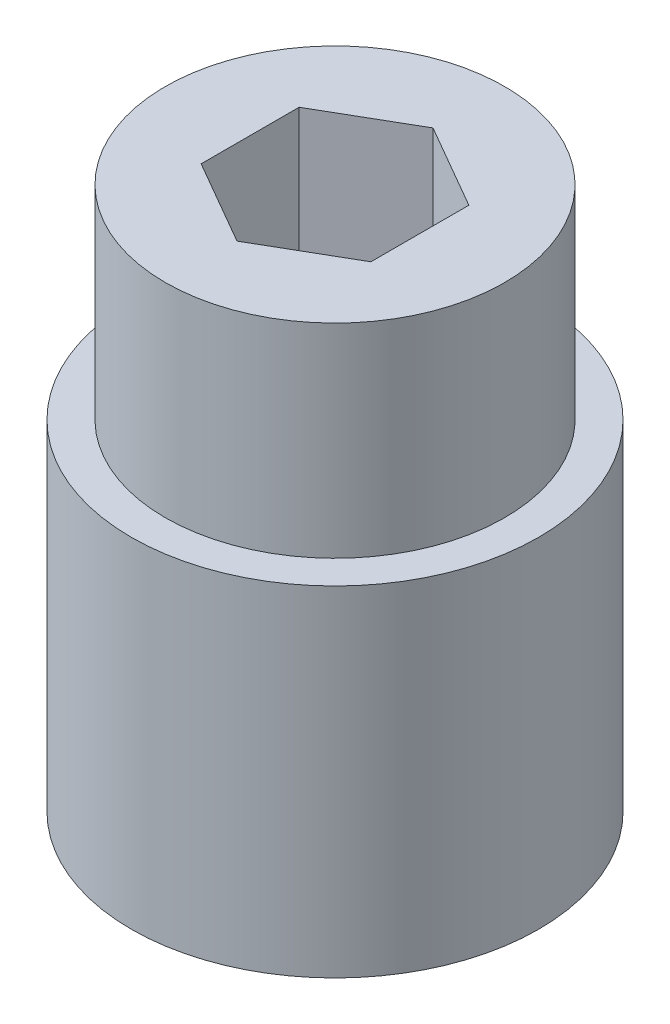
ISO-10303-21;
HEADER;
FILE_DESCRIPTION(('STEP AP214'),'2;1');
FILE_NAME('part.step','',(''),(''),'','','');
FILE_SCHEMA(('AUTOMOTIVE_DESIGN { 1 0 10303 214 1 1 1 1 }'));
ENDSEC;
DATA;
#1=APPLICATION_CONTEXT('core data for automotive mechanical design processes');
#2=APPLICATION_PROTOCOL_DEFINITION('international standard','automotive_design',2000,#1);
#3=PRODUCT_CONTEXT('',#1,'mechanical');
#4=PRODUCT('Part','Part','',(#3));
#5=PRODUCT_RELATED_PRODUCT_CATEGORY('part','',(#4));
#6=PRODUCT_DEFINITION_FORMATION('','',#4);
#7=PRODUCT_DEFINITION_CONTEXT('part definition',#1,'design');
#8=PRODUCT_DEFINITION('design','',#6,#7);
#9=PRODUCT_DEFINITION_SHAPE('','',#8);
#10=(LENGTH_UNIT() NAMED_UNIT(*) SI_UNIT(.MILLI.,.METRE.));
#11=(NAMED_UNIT(*) PLANE_ANGLE_UNIT() SI_UNIT($,.RADIAN.));
#12=(NAMED_UNIT(*) SI_UNIT($,.STERADIAN.) SOLID_ANGLE_UNIT());
#13=UNCERTAINTY_MEASURE_WITH_UNIT(LENGTH_MEASURE(1.E-05),#10,'distance_accuracy_value','');
#14=(GEOMETRIC_REPRESENTATION_CONTEXT(3) GLOBAL_UNCERTAINTY_ASSIGNED_CONTEXT((#13)) GLOBAL_UNIT_ASSIGNED_CONTEXT((#10,
#11,#12)) REPRESENTATION_CONTEXT('',''));
#15=CARTESIAN_POINT('',(0.,0.,0.));
#16=DIRECTION('',(0.,0.,1.));
#17=DIRECTION('',(1.,0.,0.));
#18=AXIS2_PLACEMENT_3D('',#15,#16,#17);
#19=CARTESIAN_POINT('',(0.,10.,0.));
#20=DIRECTION('',(0.,1.,0.));
#21=DIRECTION('',(0.,0.,1.));
#22=AXIS2_PLACEMENT_3D('',#19,#20,#21);
#23=PLANE('',#22);
#24=CARTESIAN_POINT('',(0.,10.,0.));
#25=DIRECTION('',(0.,1.,0.));
#26=DIRECTION('',(0.,0.,1.));
#27=AXIS2_PLACEMENT_3D('',#24,#25,#26);
#28=CIRCLE('',#27,5.);
#29=CARTESIAN_POINT('',(0.,10.,5.));
#30=VERTEX_POINT('',#29);
#31=EDGE_CURVE('E12',#30,#30,#28,.T.);
#32=ORIENTED_EDGE('',*,*,#31,.F.);
#33=EDGE_LOOP('',(#32));
#34=FACE_BOUND('',#33,.T.);
#35=CARTESIAN_POINT('',(0.,10.,0.));
#36=DIRECTION('',(0.,1.,0.));
#37=DIRECTION('',(0.,0.,1.));
#38=AXIS2_PLACEMENT_3D('',#35,#36,#37);
#39=CIRCLE('',#38,6.);
#40=CARTESIAN_POINT('',(0.,10.,6.));
#41=VERTEX_POINT('',#40);
#42=EDGE_CURVE('E128',#41,#41,#39,.T.);
#43=ORIENTED_EDGE('',*,*,#42,.T.);
#44=EDGE_LOOP('',(#43));
#45=FACE_BOUND('',#44,.T.);
#46=ADVANCED_FACE('F46',(#34,#45),#23,.T.);
#47=CARTESIAN_POINT('',(0.,0.,0.));
#48=DIRECTION('',(0.,1.,0.));
#49=DIRECTION('',(0.,0.,1.));
#50=AXIS2_PLACEMENT_3D('',#47,#48,#49);
#51=PLANE('',#50);
#52=DIRECTION('',(0.866025403784439,0.,-0.5));
#53=VECTOR('',#52,1.);
#54=CARTESIAN_POINT('',(0.,0.,2.88675134594813));
#55=LINE('',#54,#53);
#56=CARTESIAN_POINT('',(0.,0.,2.88675134594813));
#57=VERTEX_POINT('',#56);
#58=CARTESIAN_POINT('',(2.5,0.,1.44337567297406));
#59=VERTEX_POINT('',#58);
#60=EDGE_CURVE('E109',#57,#59,#55,.T.);
#61=ORIENTED_EDGE('',*,*,#60,.T.);
#62=DIRECTION('',(0.,0.,-1.));
#63=VECTOR('',#62,1.);
#64=CARTESIAN_POINT('',(2.5,0.,1.44337567297406));
#65=LINE('',#64,#63);
#66=CARTESIAN_POINT('',(2.5,0.,-1.44337567297406));
#67=VERTEX_POINT('',#66);
#68=EDGE_CURVE('E102',#59,#67,#65,.T.);
#69=ORIENTED_EDGE('',*,*,#68,.T.);
#70=DIRECTION('',(-0.866025403784438,0.,-0.5));
#71=VECTOR('',#70,1.);
#72=CARTESIAN_POINT('',(2.5,0.,-1.44337567297406));
#73=LINE('',#72,#71);
#74=CARTESIAN_POINT('',(0.,0.,-2.88675134594813));
#75=VERTEX_POINT('',#74);
#76=EDGE_CURVE('E112',#67,#75,#73,.T.);
#77=ORIENTED_EDGE('',*,*,#76,.T.);
#78=DIRECTION('',(-0.866025403784439,0.,0.5));
#79=VECTOR('',#78,1.);
#80=CARTESIAN_POINT('',(0.,0.,-2.88675134594813));
#81=LINE('',#80,#79);
#82=CARTESIAN_POINT('',(-2.5,0.,-1.44337567297406));
#83=VERTEX_POINT('',#82);
#84=EDGE_CURVE('E62',#75,#83,#81,.T.);
#85=ORIENTED_EDGE('',*,*,#84,.T.);
#86=DIRECTION('',(0.,0.,1.));
#87=VECTOR('',#86,1.);
#88=CARTESIAN_POINT('',(-2.5,0.,-1.44337567297406));
#89=LINE('',#88,#87);
#90=CARTESIAN_POINT('',(-2.5,0.,1.44337567297406));
#91=VERTEX_POINT('',#90);
#92=EDGE_CURVE('E133',#83,#91,#89,.T.);
#93=ORIENTED_EDGE('',*,*,#92,.T.);
#94=DIRECTION('',(0.866025403784439,0.,0.5));
#95=VECTOR('',#94,1.);
#96=CARTESIAN_POINT('',(-2.5,0.,1.44337567297406));
#97=LINE('',#96,#95);
#98=EDGE_CURVE('E137',#91,#57,#97,.T.);
#99=ORIENTED_EDGE('',*,*,#98,.T.);
#100=EDGE_LOOP('',(#61,#69,#77,#85,#93,#99));
#101=FACE_BOUND('',#100,.T.);
#102=CARTESIAN_POINT('',(0.,0.,0.));
#103=DIRECTION('',(0.,1.,0.));
#104=DIRECTION('',(0.,0.,1.));
#105=AXIS2_PLACEMENT_3D('',#102,#103,#104);
#106=CIRCLE('',#105,6.);
#107=CARTESIAN_POINT('',(0.,0.,6.));
#108=VERTEX_POINT('',#107);
#109=EDGE_CURVE('E145',#108,#108,#106,.T.);
#110=ORIENTED_EDGE('',*,*,#109,.F.);
#111=EDGE_LOOP('',(#110));
#112=FACE_BOUND('',#111,.T.);
#113=ADVANCED_FACE('F48',(#101,#112),#51,.F.);
#114=CARTESIAN_POINT('',(0.,16.,0.));
#115=DIRECTION('',(0.,-1.,0.));
#116=DIRECTION('',(0.,0.,-1.));
#117=AXIS2_PLACEMENT_3D('',#114,#115,#116);
#118=CYLINDRICAL_SURFACE('',#117,5.);
#119=CARTESIAN_POINT('',(0.,16.,0.));
#120=DIRECTION('',(0.,1.,0.));
#121=DIRECTION('',(0.,0.,1.));
#122=AXIS2_PLACEMENT_3D('',#119,#120,#121);
#123=CIRCLE('',#122,5.);
#124=CARTESIAN_POINT('',(0.,16.,5.));
#125=VERTEX_POINT('',#124);
#126=EDGE_CURVE('E55',#125,#125,#123,.T.);
#127=ORIENTED_EDGE('',*,*,#126,.F.);
#128=EDGE_LOOP('',(#127));
#129=FACE_BOUND('',#128,.T.);
#130=ORIENTED_EDGE('',*,*,#31,.T.);
#131=EDGE_LOOP('',(#130));
#132=FACE_BOUND('',#131,.T.);
#133=ADVANCED_FACE('F178',(#129,#132),#118,.T.);
#134=CARTESIAN_POINT('',(0.,16.,0.));
#135=DIRECTION('',(0.,1.,0.));
#136=DIRECTION('',(0.,0.,1.));
#137=AXIS2_PLACEMENT_3D('',#134,#135,#136);
#138=PLANE('',#137);
#139=DIRECTION('',(0.,0.,-1.));
#140=VECTOR('',#139,1.);
#141=CARTESIAN_POINT('',(2.5,16.,1.44337567297406));
#142=LINE('',#141,#140);
#143=CARTESIAN_POINT('',(2.5,16.,1.44337567297406));
#144=VERTEX_POINT('',#143);
#145=CARTESIAN_POINT('',(2.5,16.,-1.44337567297406));
#146=VERTEX_POINT('',#145);
#147=EDGE_CURVE('E70',#144,#146,#142,.T.);
#148=ORIENTED_EDGE('',*,*,#147,.F.);
#149=DIRECTION('',(0.866025403784439,0.,-0.5));
#150=VECTOR('',#149,1.);
#151=CARTESIAN_POINT('',(0.,16.,2.88675134594813));
#152=LINE('',#151,#150);
#153=CARTESIAN_POINT('',(0.,16.,2.88675134594813));
#154=VERTEX_POINT('',#153);
#155=EDGE_CURVE('E121',#154,#144,#152,.T.);
#156=ORIENTED_EDGE('',*,*,#155,.F.);
#157=DIRECTION('',(0.866025403784439,0.,0.5));
#158=VECTOR('',#157,1.);
#159=CARTESIAN_POINT('',(-2.5,16.,1.44337567297406));
#160=LINE('',#159,#158);
#161=CARTESIAN_POINT('',(-2.5,16.,1.44337567297406));
#162=VERTEX_POINT('',#161);
#163=EDGE_CURVE('E125',#162,#154,#160,.T.);
#164=ORIENTED_EDGE('',*,*,#163,.F.);
#165=DIRECTION('',(0.,0.,1.));
#166=VECTOR('',#165,1.);
#167=CARTESIAN_POINT('',(-2.5,16.,-1.44337567297406));
#168=LINE('',#167,#166);
#169=CARTESIAN_POINT('',(-2.5,16.,-1.44337567297406));
#170=VERTEX_POINT('',#169);
#171=EDGE_CURVE('E152',#170,#162,#168,.T.);
#172=ORIENTED_EDGE('',*,*,#171,.F.);
#173=DIRECTION('',(-0.866025403784439,0.,0.5));
#174=VECTOR('',#173,1.);
#175=CARTESIAN_POINT('',(0.,16.,-2.88675134594813));
#176=LINE('',#175,#174);
#177=CARTESIAN_POINT('',(0.,16.,-2.88675134594813));
#178=VERTEX_POINT('',#177);
#179=EDGE_CURVE('E148',#178,#170,#176,.T.);
#180=ORIENTED_EDGE('',*,*,#179,.F.);
#181=DIRECTION('',(-0.866025403784438,0.,-0.5));
#182=VECTOR('',#181,1.);
#183=CARTESIAN_POINT('',(2.5,16.,-1.44337567297406));
#184=LINE('',#183,#182);
#185=EDGE_CURVE('E144',#146,#178,#184,.T.);
#186=ORIENTED_EDGE('',*,*,#185,.F.);
#187=EDGE_LOOP('',(#148,#156,#164,#172,#180,#186));
#188=FACE_BOUND('',#187,.T.);
#189=ORIENTED_EDGE('',*,*,#126,.T.);
#190=EDGE_LOOP('',(#189));
#191=FACE_BOUND('',#190,.T.);
#192=ADVANCED_FACE('F176',(#188,#191),#138,.T.);
#193=CARTESIAN_POINT('',(2.5,0.,1.44337567297406));
#194=DIRECTION('',(1.,0.,0.));
#195=DIRECTION('',(0.,0.,-1.));
#196=AXIS2_PLACEMENT_3D('',#193,#194,#195);
#197=PLANE('',#196);
#198=ORIENTED_EDGE('',*,*,#147,.T.);
#199=DIRECTION('',(0.,1.,0.));
#200=VECTOR('',#199,1.);
#201=CARTESIAN_POINT('',(2.5,0.,-1.44337567297406));
#202=LINE('',#201,#200);
#203=EDGE_CURVE('E98',#67,#146,#202,.T.);
#204=ORIENTED_EDGE('',*,*,#203,.F.);
#205=ORIENTED_EDGE('',*,*,#68,.F.);
#206=DIRECTION('',(0.,1.,0.));
#207=VECTOR('',#206,1.);
#208=CARTESIAN_POINT('',(2.5,0.,1.44337567297406));
#209=LINE('',#208,#207);
#210=EDGE_CURVE('E159',#59,#144,#209,.T.);
#211=ORIENTED_EDGE('',*,*,#210,.T.);
#212=EDGE_LOOP('',(#198,#204,#205,#211));
#213=FACE_BOUND('',#212,.T.);
#214=ADVANCED_FACE('F100',(#213),#197,.F.);
#215=CARTESIAN_POINT('',(0.,0.,2.88675134594813));
#216=DIRECTION('',(0.5,0.,0.866025403784439));
#217=DIRECTION('',(0.866025403784439,0.,-0.5));
#218=AXIS2_PLACEMENT_3D('',#215,#216,#217);
#219=PLANE('',#218);
#220=ORIENTED_EDGE('',*,*,#155,.T.);
#221=ORIENTED_EDGE('',*,*,#210,.F.);
#222=ORIENTED_EDGE('',*,*,#60,.F.);
#223=DIRECTION('',(0.,1.,0.));
#224=VECTOR('',#223,1.);
#225=CARTESIAN_POINT('',(0.,0.,2.88675134594813));
#226=LINE('',#225,#224);
#227=EDGE_CURVE('E162',#57,#154,#226,.T.);
#228=ORIENTED_EDGE('',*,*,#227,.T.);
#229=EDGE_LOOP('',(#220,#221,#222,#228));
#230=FACE_BOUND('',#229,.T.);
#231=ADVANCED_FACE('F250',(#230),#219,.F.);
#232=CARTESIAN_POINT('',(-2.5,0.,1.44337567297406));
#233=DIRECTION('',(-0.5,0.,0.866025403784439));
#234=DIRECTION('',(0.866025403784439,0.,0.5));
#235=AXIS2_PLACEMENT_3D('',#232,#233,#234);
#236=PLANE('',#235);
#237=ORIENTED_EDGE('',*,*,#163,.T.);
#238=ORIENTED_EDGE('',*,*,#227,.F.);
#239=ORIENTED_EDGE('',*,*,#98,.F.);
#240=DIRECTION('',(0.,1.,0.));
#241=VECTOR('',#240,1.);
#242=CARTESIAN_POINT('',(-2.5,0.,1.44337567297406));
#243=LINE('',#242,#241);
#244=EDGE_CURVE('E165',#91,#162,#243,.T.);
#245=ORIENTED_EDGE('',*,*,#244,.T.);
#246=EDGE_LOOP('',(#237,#238,#239,#245));
#247=FACE_BOUND('',#246,.T.);
#248=ADVANCED_FACE('F240',(#247),#236,.F.);
#249=CARTESIAN_POINT('',(-2.5,0.,-1.44337567297406));
#250=DIRECTION('',(-1.,0.,0.));
#251=DIRECTION('',(0.,0.,1.));
#252=AXIS2_PLACEMENT_3D('',#249,#250,#251);
#253=PLANE('',#252);
#254=ORIENTED_EDGE('',*,*,#171,.T.);
#255=ORIENTED_EDGE('',*,*,#244,.F.);
#256=ORIENTED_EDGE('',*,*,#92,.F.);
#257=DIRECTION('',(0.,1.,0.));
#258=VECTOR('',#257,1.);
#259=CARTESIAN_POINT('',(-2.5,0.,-1.44337567297406));
#260=LINE('',#259,#258);
#261=EDGE_CURVE('E168',#83,#170,#260,.T.);
#262=ORIENTED_EDGE('',*,*,#261,.T.);
#263=EDGE_LOOP('',(#254,#255,#256,#262));
#264=FACE_BOUND('',#263,.T.);
#265=ADVANCED_FACE('F231',(#264),#253,.F.);
#266=CARTESIAN_POINT('',(0.,0.,-2.88675134594813));
#267=DIRECTION('',(-0.5,0.,-0.866025403784439));
#268=DIRECTION('',(-0.866025403784439,0.,0.5));
#269=AXIS2_PLACEMENT_3D('',#266,#267,#268);
#270=PLANE('',#269);
#271=ORIENTED_EDGE('',*,*,#179,.T.);
#272=ORIENTED_EDGE('',*,*,#261,.F.);
#273=ORIENTED_EDGE('',*,*,#84,.F.);
#274=DIRECTION('',(0.,1.,0.));
#275=VECTOR('',#274,1.);
#276=CARTESIAN_POINT('',(0.,0.,-2.88675134594813));
#277=LINE('',#276,#275);
#278=EDGE_CURVE('E108',#75,#178,#277,.T.);
#279=ORIENTED_EDGE('',*,*,#278,.T.);
#280=EDGE_LOOP('',(#271,#272,#273,#279));
#281=FACE_BOUND('',#280,.T.);
#282=ADVANCED_FACE('F222',(#281),#270,.F.);
#283=CARTESIAN_POINT('',(2.5,0.,-1.44337567297406));
#284=DIRECTION('',(0.5,0.,-0.866025403784438));
#285=DIRECTION('',(-0.866025403784438,0.,-0.5));
#286=AXIS2_PLACEMENT_3D('',#283,#284,#285);
#287=PLANE('',#286);
#288=ORIENTED_EDGE('',*,*,#185,.T.);
#289=ORIENTED_EDGE('',*,*,#278,.F.);
#290=ORIENTED_EDGE('',*,*,#76,.F.);
#291=ORIENTED_EDGE('',*,*,#203,.T.);
#292=EDGE_LOOP('',(#288,#289,#290,#291));
#293=FACE_BOUND('',#292,.T.);
#294=ADVANCED_FACE('F113',(#293),#287,.F.);
#295=CARTESIAN_POINT('',(0.,0.,0.));
#296=DIRECTION('',(0.,1.,0.));
#297=DIRECTION('',(0.,0.,1.));
#298=AXIS2_PLACEMENT_3D('',#295,#296,#297);
#299=CYLINDRICAL_SURFACE('',#298,6.);
#300=ORIENTED_EDGE('',*,*,#109,.T.);
#301=EDGE_LOOP('',(#300));
#302=FACE_BOUND('',#301,.T.);
#303=ORIENTED_EDGE('',*,*,#42,.F.);
#304=EDGE_LOOP('',(#303));
#305=FACE_BOUND('',#304,.T.);
#306=ADVANCED_FACE('F194',(#302,#305),#299,.T.);
#307=CLOSED_SHELL('',(#46,#113,#133,#192,#214,#231,#248,#265,#282,#294,#306));
#308=MANIFOLD_SOLID_BREP('B2',#307);
#309=ADVANCED_BREP_SHAPE_REPRESENTATION('',(#18,#308),#14);
#310=SHAPE_DEFINITION_REPRESENTATION(#9,#309);
ENDSEC;
END-ISO-10303-21;
